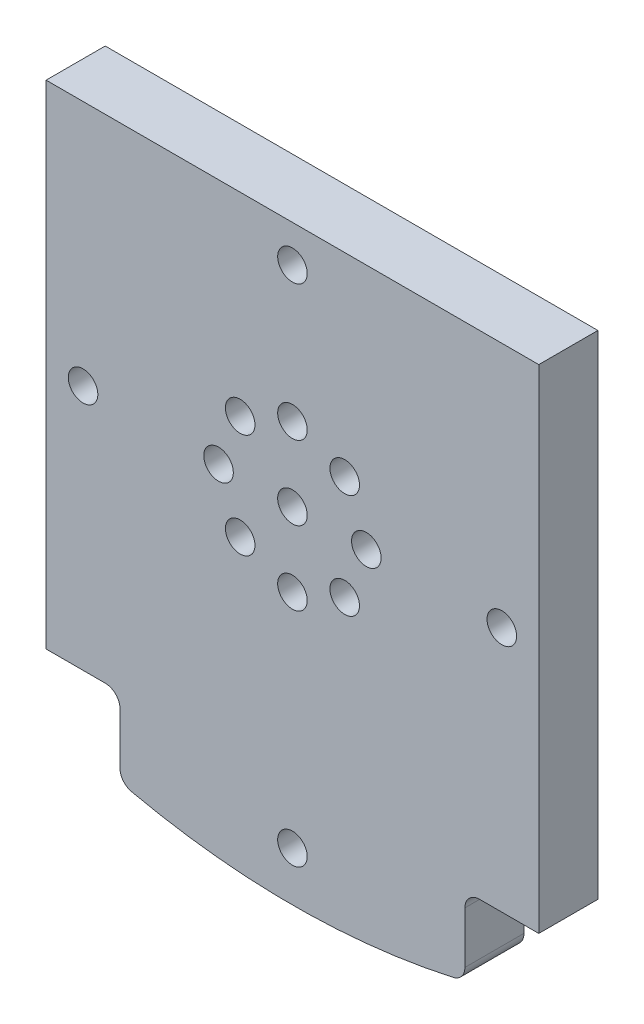
ISO-10303-21;
HEADER;
FILE_DESCRIPTION(('STEP AP214'),'2;1');
FILE_NAME('part.step','',(''),(''),'','','');
FILE_SCHEMA(('AUTOMOTIVE_DESIGN { 1 0 10303 214 1 1 1 1 }'));
ENDSEC;
DATA;
#1=APPLICATION_CONTEXT('core data for automotive mechanical design processes');
#2=APPLICATION_PROTOCOL_DEFINITION('international standard','automotive_design',2000,#1);
#3=PRODUCT_CONTEXT('',#1,'mechanical');
#4=PRODUCT('Part','Part','',(#3));
#5=PRODUCT_RELATED_PRODUCT_CATEGORY('part','',(#4));
#6=PRODUCT_DEFINITION_FORMATION('','',#4);
#7=PRODUCT_DEFINITION_CONTEXT('part definition',#1,'design');
#8=PRODUCT_DEFINITION('design','',#6,#7);
#9=PRODUCT_DEFINITION_SHAPE('','',#8);
#10=(LENGTH_UNIT() NAMED_UNIT(*) SI_UNIT(.MILLI.,.METRE.));
#11=(NAMED_UNIT(*) PLANE_ANGLE_UNIT() SI_UNIT($,.RADIAN.));
#12=(NAMED_UNIT(*) SI_UNIT($,.STERADIAN.) SOLID_ANGLE_UNIT());
#13=UNCERTAINTY_MEASURE_WITH_UNIT(LENGTH_MEASURE(1.E-05),#10,'distance_accuracy_value','');
#14=(GEOMETRIC_REPRESENTATION_CONTEXT(3) GLOBAL_UNCERTAINTY_ASSIGNED_CONTEXT((#13)) GLOBAL_UNIT_ASSIGNED_CONTEXT((#10,
#11,#12)) REPRESENTATION_CONTEXT('',''));
#15=CARTESIAN_POINT('',(0.,0.,0.));
#16=DIRECTION('',(0.,0.,1.));
#17=DIRECTION('',(1.,0.,0.));
#18=AXIS2_PLACEMENT_3D('',#15,#16,#17);
#19=CARTESIAN_POINT('',(0.,-60.,12.));
#20=DIRECTION('',(0.,0.,-1.));
#21=DIRECTION('',(-1.,0.,0.));
#22=AXIS2_PLACEMENT_3D('',#19,#20,#21);
#23=CYLINDRICAL_SURFACE('',#22,3.);
#24=CARTESIAN_POINT('',(0.,-60.,12.));
#25=DIRECTION('',(0.,0.,1.));
#26=DIRECTION('',(1.,0.,0.));
#27=AXIS2_PLACEMENT_3D('',#24,#25,#26);
#28=CIRCLE('',#27,3.);
#29=CARTESIAN_POINT('',(3.,-60.,12.));
#30=VERTEX_POINT('',#29);
#31=EDGE_CURVE('E274',#30,#30,#28,.T.);
#32=ORIENTED_EDGE('',*,*,#31,.T.);
#33=EDGE_LOOP('',(#32));
#34=FACE_BOUND('',#33,.T.);
#35=CARTESIAN_POINT('',(0.,-60.,6.));
#36=DIRECTION('',(0.,0.,-1.));
#37=DIRECTION('',(-1.,0.,0.));
#38=AXIS2_PLACEMENT_3D('',#35,#36,#37);
#39=CIRCLE('',#38,3.);
#40=CARTESIAN_POINT('',(-3.,-60.,6.));
#41=VERTEX_POINT('',#40);
#42=EDGE_CURVE('E37',#41,#41,#39,.T.);
#43=ORIENTED_EDGE('',*,*,#42,.T.);
#44=EDGE_LOOP('',(#43));
#45=FACE_BOUND('',#44,.T.);
#46=ADVANCED_FACE('F33',(#34,#45),#23,.F.);
#47=CARTESIAN_POINT('',(-38.,-53.,12.));
#48=DIRECTION('',(0.,0.,1.));
#49=DIRECTION('',(1.,0.,0.));
#50=AXIS2_PLACEMENT_3D('',#47,#48,#49);
#51=PLANE('',#50);
#52=CARTESIAN_POINT('',(-2.9810173706826E-12,15.,12.));
#53=DIRECTION('',(0.,0.,1.));
#54=DIRECTION('',(1.,0.,0.));
#55=AXIS2_PLACEMENT_3D('',#52,#53,#54);
#56=CIRCLE('',#55,3.);
#57=CARTESIAN_POINT('',(2.99999999999702,15.,12.));
#58=VERTEX_POINT('',#57);
#59=EDGE_CURVE('E313',#58,#58,#56,.T.);
#60=ORIENTED_EDGE('',*,*,#59,.F.);
#61=EDGE_LOOP('',(#60));
#62=FACE_BOUND('',#61,.T.);
#63=CARTESIAN_POINT('',(-15.,-2.1987620058006E-12,12.));
#64=DIRECTION('',(0.,0.,1.));
#65=DIRECTION('',(1.,0.,0.));
#66=AXIS2_PLACEMENT_3D('',#63,#64,#65);
#67=CIRCLE('',#66,3.);
#68=CARTESIAN_POINT('',(-12.,-2.1987620058006E-12,12.));
#69=VERTEX_POINT('',#68);
#70=EDGE_CURVE('E301',#69,#69,#67,.T.);
#71=ORIENTED_EDGE('',*,*,#70,.F.);
#72=EDGE_LOOP('',(#71));
#73=FACE_BOUND('',#72,.T.);
#74=CARTESIAN_POINT('',(6.01949046163952E-13,-15.,12.));
#75=DIRECTION('',(0.,0.,1.));
#76=DIRECTION('',(1.,0.,0.));
#77=AXIS2_PLACEMENT_3D('',#74,#75,#76);
#78=CIRCLE('',#77,3.);
#79=CARTESIAN_POINT('',(3.0000000000006,-15.,12.));
#80=VERTEX_POINT('',#79);
#81=EDGE_CURVE('E289',#80,#80,#78,.T.);
#82=ORIENTED_EDGE('',*,*,#81,.F.);
#83=EDGE_LOOP('',(#82));
#84=FACE_BOUND('',#83,.T.);
#85=CARTESIAN_POINT('',(0.,0.,12.));
#86=DIRECTION('',(0.,0.,1.));
#87=DIRECTION('',(1.,0.,0.));
#88=AXIS2_PLACEMENT_3D('',#85,#86,#87);
#89=CIRCLE('',#88,3.);
#90=CARTESIAN_POINT('',(3.00000000000001,0.,12.));
#91=VERTEX_POINT('',#90);
#92=EDGE_CURVE('E279',#91,#91,#89,.T.);
#93=ORIENTED_EDGE('',*,*,#92,.F.);
#94=EDGE_LOOP('',(#93));
#95=FACE_BOUND('',#94,.T.);
#96=CARTESIAN_POINT('',(42.5,0.,12.));
#97=DIRECTION('',(0.,0.,1.));
#98=DIRECTION('',(1.,0.,0.));
#99=AXIS2_PLACEMENT_3D('',#96,#97,#98);
#100=CIRCLE('',#99,3.);
#101=CARTESIAN_POINT('',(45.5,0.,12.));
#102=VERTEX_POINT('',#101);
#103=EDGE_CURVE('E268',#102,#102,#100,.T.);
#104=ORIENTED_EDGE('',*,*,#103,.F.);
#105=EDGE_LOOP('',(#104));
#106=FACE_BOUND('',#105,.T.);
#107=CARTESIAN_POINT('',(10.6066017177982,-10.6066017177982,12.));
#108=DIRECTION('',(0.,0.,1.));
#109=DIRECTION('',(1.,0.,0.));
#110=AXIS2_PLACEMENT_3D('',#107,#108,#109);
#111=CIRCLE('',#110,3.);
#112=CARTESIAN_POINT('',(13.6066017177982,-10.6066017177982,12.));
#113=VERTEX_POINT('',#112);
#114=EDGE_CURVE('E256',#113,#113,#111,.T.);
#115=ORIENTED_EDGE('',*,*,#114,.F.);
#116=EDGE_LOOP('',(#115));
#117=FACE_BOUND('',#116,.T.);
#118=DIRECTION('',(-1.,0.,0.));
#119=VECTOR('',#118,1.);
#120=CARTESIAN_POINT('',(0.,50.,12.));
#121=LINE('',#120,#119);
#122=CARTESIAN_POINT('',(50.,50.,12.));
#123=VERTEX_POINT('',#122);
#124=CARTESIAN_POINT('',(-50.,50.,12.));
#125=VERTEX_POINT('',#124);
#126=EDGE_CURVE('E51',#123,#125,#121,.T.);
#127=ORIENTED_EDGE('',*,*,#126,.T.);
#128=DIRECTION('',(0.,-1.,0.));
#129=VECTOR('',#128,1.);
#130=CARTESIAN_POINT('',(-50.,-50.,12.));
#131=LINE('',#130,#129);
#132=CARTESIAN_POINT('',(-50.,-50.,12.));
#133=VERTEX_POINT('',#132);
#134=EDGE_CURVE('E107',#125,#133,#131,.T.);
#135=ORIENTED_EDGE('',*,*,#134,.T.);
#136=DIRECTION('',(1.,0.,0.));
#137=VECTOR('',#136,1.);
#138=CARTESIAN_POINT('',(-38.,-50.,12.));
#139=LINE('',#138,#137);
#140=CARTESIAN_POINT('',(-38.,-50.,12.));
#141=VERTEX_POINT('',#140);
#142=EDGE_CURVE('E209',#133,#141,#139,.T.);
#143=ORIENTED_EDGE('',*,*,#142,.T.);
#144=CARTESIAN_POINT('',(-38.,-53.,12.));
#145=DIRECTION('',(0.,0.,-1.));
#146=DIRECTION('',(1.,0.,0.));
#147=AXIS2_PLACEMENT_3D('',#144,#145,#146);
#148=CIRCLE('',#147,3.00000000000001);
#149=CARTESIAN_POINT('',(-35.,-53.,12.));
#150=VERTEX_POINT('',#149);
#151=EDGE_CURVE('E229',#141,#150,#148,.T.);
#152=ORIENTED_EDGE('',*,*,#151,.T.);
#153=DIRECTION('',(0.,-1.,0.));
#154=VECTOR('',#153,1.);
#155=CARTESIAN_POINT('',(-35.,-53.,12.));
#156=LINE('',#155,#154);
#157=CARTESIAN_POINT('',(-35.,-63.4747364521015,12.));
#158=VERTEX_POINT('',#157);
#159=EDGE_CURVE('E226',#150,#158,#156,.T.);
#160=ORIENTED_EDGE('',*,*,#159,.T.);
#161=CARTESIAN_POINT('',(-32.,-63.4747364521015,12.));
#162=DIRECTION('',(0.,0.,1.));
#163=DIRECTION('',(-1.,0.,0.));
#164=AXIS2_PLACEMENT_3D('',#161,#162,#163);
#165=CIRCLE('',#164,3.00000000000002);
#166=CARTESIAN_POINT('',(-32.6530612244898,-66.4027922980628,12.));
#167=VERTEX_POINT('',#166);
#168=EDGE_CURVE('E228',#158,#167,#165,.T.);
#169=ORIENTED_EDGE('',*,*,#168,.T.);
#170=CARTESIAN_POINT('',(0.,80.,12.));
#171=DIRECTION('',(0.,0.,1.));
#172=DIRECTION('',(1.,0.,0.));
#173=AXIS2_PLACEMENT_3D('',#170,#171,#172);
#174=CIRCLE('',#173,150.);
#175=CARTESIAN_POINT('',(32.6530612244897,-66.4027922980628,12.));
#176=VERTEX_POINT('',#175);
#177=EDGE_CURVE('E231',#167,#176,#174,.T.);
#178=ORIENTED_EDGE('',*,*,#177,.T.);
#179=CARTESIAN_POINT('',(32.,-63.4747364521016,12.));
#180=DIRECTION('',(0.,0.,1.));
#181=DIRECTION('',(-1.,0.,0.));
#182=AXIS2_PLACEMENT_3D('',#179,#180,#181);
#183=CIRCLE('',#182,3.00000000000001);
#184=CARTESIAN_POINT('',(35.,-63.4747364521016,12.));
#185=VERTEX_POINT('',#184);
#186=EDGE_CURVE('E237',#176,#185,#183,.T.);
#187=ORIENTED_EDGE('',*,*,#186,.T.);
#188=DIRECTION('',(0.,1.,0.));
#189=VECTOR('',#188,1.);
#190=CARTESIAN_POINT('',(35.,-53.,12.));
#191=LINE('',#190,#189);
#192=CARTESIAN_POINT('',(35.,-53.,12.));
#193=VERTEX_POINT('',#192);
#194=EDGE_CURVE('E140',#185,#193,#191,.T.);
#195=ORIENTED_EDGE('',*,*,#194,.T.);
#196=CARTESIAN_POINT('',(38.,-53.,12.));
#197=DIRECTION('',(0.,0.,-1.));
#198=DIRECTION('',(1.,0.,0.));
#199=AXIS2_PLACEMENT_3D('',#196,#197,#198);
#200=CIRCLE('',#199,3.);
#201=CARTESIAN_POINT('',(38.,-50.,12.));
#202=VERTEX_POINT('',#201);
#203=EDGE_CURVE('E133',#193,#202,#200,.T.);
#204=ORIENTED_EDGE('',*,*,#203,.T.);
#205=DIRECTION('',(1.,0.,0.));
#206=VECTOR('',#205,1.);
#207=CARTESIAN_POINT('',(50.,-50.,12.));
#208=LINE('',#207,#206);
#209=CARTESIAN_POINT('',(50.,-50.,12.));
#210=VERTEX_POINT('',#209);
#211=EDGE_CURVE('E138',#202,#210,#208,.T.);
#212=ORIENTED_EDGE('',*,*,#211,.T.);
#213=DIRECTION('',(0.,1.,0.));
#214=VECTOR('',#213,1.);
#215=CARTESIAN_POINT('',(50.,-50.,12.));
#216=LINE('',#215,#214);
#217=EDGE_CURVE('E154',#210,#123,#216,.T.);
#218=ORIENTED_EDGE('',*,*,#217,.T.);
#219=EDGE_LOOP('',(#127,#135,#143,#152,#160,#169,#178,#187,#195,#204,#212,#218));
#220=FACE_BOUND('',#219,.T.);
#221=CARTESIAN_POINT('',(15.,0.,12.));
#222=DIRECTION('',(0.,0.,1.));
#223=DIRECTION('',(1.,0.,0.));
#224=AXIS2_PLACEMENT_3D('',#221,#222,#223);
#225=CIRCLE('',#224,3.);
#226=CARTESIAN_POINT('',(18.,0.,12.));
#227=VERTEX_POINT('',#226);
#228=EDGE_CURVE('E163',#227,#227,#225,.T.);
#229=ORIENTED_EDGE('',*,*,#228,.F.);
#230=EDGE_LOOP('',(#229));
#231=FACE_BOUND('',#230,.T.);
#232=CARTESIAN_POINT('',(-42.5,0.,12.));
#233=DIRECTION('',(0.,0.,1.));
#234=DIRECTION('',(1.,0.,0.));
#235=AXIS2_PLACEMENT_3D('',#232,#233,#234);
#236=CIRCLE('',#235,3.);
#237=CARTESIAN_POINT('',(-39.5,0.,12.));
#238=VERTEX_POINT('',#237);
#239=EDGE_CURVE('E262',#238,#238,#236,.T.);
#240=ORIENTED_EDGE('',*,*,#239,.F.);
#241=EDGE_LOOP('',(#240));
#242=FACE_BOUND('',#241,.T.);
#243=ORIENTED_EDGE('',*,*,#31,.F.);
#244=EDGE_LOOP('',(#243));
#245=FACE_BOUND('',#244,.T.);
#246=CARTESIAN_POINT('',(0.,42.5,12.));
#247=DIRECTION('',(0.,0.,1.));
#248=DIRECTION('',(1.,0.,0.));
#249=AXIS2_PLACEMENT_3D('',#246,#247,#248);
#250=CIRCLE('',#249,3.);
#251=CARTESIAN_POINT('',(3.00000000000001,42.5,12.));
#252=VERTEX_POINT('',#251);
#253=EDGE_CURVE('E283',#252,#252,#250,.T.);
#254=ORIENTED_EDGE('',*,*,#253,.F.);
#255=EDGE_LOOP('',(#254));
#256=FACE_BOUND('',#255,.T.);
#257=CARTESIAN_POINT('',(-10.6066017177972,-10.6066017177992,12.));
#258=DIRECTION('',(0.,0.,1.));
#259=DIRECTION('',(1.,0.,0.));
#260=AXIS2_PLACEMENT_3D('',#257,#258,#259);
#261=CIRCLE('',#260,3.);
#262=CARTESIAN_POINT('',(-7.60660171779722,-10.6066017177992,12.));
#263=VERTEX_POINT('',#262);
#264=EDGE_CURVE('E295',#263,#263,#261,.T.);
#265=ORIENTED_EDGE('',*,*,#264,.F.);
#266=EDGE_LOOP('',(#265));
#267=FACE_BOUND('',#266,.T.);
#268=CARTESIAN_POINT('',(-10.6066017178002,10.6066017177962,12.));
#269=DIRECTION('',(0.,0.,1.));
#270=DIRECTION('',(1.,0.,0.));
#271=AXIS2_PLACEMENT_3D('',#268,#269,#270);
#272=CIRCLE('',#271,3.);
#273=CARTESIAN_POINT('',(-7.60660171780018,10.6066017177962,12.));
#274=VERTEX_POINT('',#273);
#275=EDGE_CURVE('E307',#274,#274,#272,.T.);
#276=ORIENTED_EDGE('',*,*,#275,.F.);
#277=EDGE_LOOP('',(#276));
#278=FACE_BOUND('',#277,.T.);
#279=CARTESIAN_POINT('',(10.6066017177961,10.6066017178003,12.));
#280=DIRECTION('',(0.,0.,1.));
#281=DIRECTION('',(1.,0.,0.));
#282=AXIS2_PLACEMENT_3D('',#279,#280,#281);
#283=CIRCLE('',#282,3.);
#284=CARTESIAN_POINT('',(13.6066017177961,10.6066017178003,12.));
#285=VERTEX_POINT('',#284);
#286=EDGE_CURVE('E319',#285,#285,#283,.T.);
#287=ORIENTED_EDGE('',*,*,#286,.F.);
#288=EDGE_LOOP('',(#287));
#289=FACE_BOUND('',#288,.T.);
#290=ADVANCED_FACE('F135',(#62,#73,#84,#95,#106,#117,#220,#231,#242,#245,#256,#267,#278,#289),
#51,.T.);
#291=CARTESIAN_POINT('',(-38.,-53.,0.));
#292=DIRECTION('',(0.,0.,1.));
#293=DIRECTION('',(1.,0.,0.));
#294=AXIS2_PLACEMENT_3D('',#291,#292,#293);
#295=PLANE('',#294);
#296=CARTESIAN_POINT('',(0.,-60.,0.));
#297=DIRECTION('',(0.,0.,-1.));
#298=DIRECTION('',(-1.,0.,0.));
#299=AXIS2_PLACEMENT_3D('',#296,#297,#298);
#300=CIRCLE('',#299,5.5);
#301=CARTESIAN_POINT('',(-5.5,-60.,0.));
#302=VERTEX_POINT('',#301);
#303=EDGE_CURVE('E327',#302,#302,#300,.T.);
#304=ORIENTED_EDGE('',*,*,#303,.F.);
#305=EDGE_LOOP('',(#304));
#306=FACE_BOUND('',#305,.T.);
#307=DIRECTION('',(0.,-1.,0.));
#308=VECTOR('',#307,1.);
#309=CARTESIAN_POINT('',(-50.,-50.,0.));
#310=LINE('',#309,#308);
#311=CARTESIAN_POINT('',(-50.,50.,0.));
#312=VERTEX_POINT('',#311);
#313=CARTESIAN_POINT('',(-50.,-50.,0.));
#314=VERTEX_POINT('',#313);
#315=EDGE_CURVE('E160',#312,#314,#310,.T.);
#316=ORIENTED_EDGE('',*,*,#315,.F.);
#317=DIRECTION('',(-1.,0.,0.));
#318=VECTOR('',#317,1.);
#319=CARTESIAN_POINT('',(50.,50.,0.));
#320=LINE('',#319,#318);
#321=CARTESIAN_POINT('',(50.,50.,0.));
#322=VERTEX_POINT('',#321);
#323=EDGE_CURVE('E180',#322,#312,#320,.T.);
#324=ORIENTED_EDGE('',*,*,#323,.F.);
#325=DIRECTION('',(0.,1.,0.));
#326=VECTOR('',#325,1.);
#327=CARTESIAN_POINT('',(50.,-50.,0.));
#328=LINE('',#327,#326);
#329=CARTESIAN_POINT('',(50.,-50.,0.));
#330=VERTEX_POINT('',#329);
#331=EDGE_CURVE('E100',#330,#322,#328,.T.);
#332=ORIENTED_EDGE('',*,*,#331,.F.);
#333=DIRECTION('',(1.,0.,0.));
#334=VECTOR('',#333,1.);
#335=CARTESIAN_POINT('',(50.,-50.,0.));
#336=LINE('',#335,#334);
#337=CARTESIAN_POINT('',(38.,-50.,0.));
#338=VERTEX_POINT('',#337);
#339=EDGE_CURVE('E93',#338,#330,#336,.T.);
#340=ORIENTED_EDGE('',*,*,#339,.F.);
#341=CARTESIAN_POINT('',(38.,-53.,0.));
#342=DIRECTION('',(0.,0.,-1.));
#343=DIRECTION('',(1.,0.,0.));
#344=AXIS2_PLACEMENT_3D('',#341,#342,#343);
#345=CIRCLE('',#344,3.);
#346=CARTESIAN_POINT('',(35.,-53.,0.));
#347=VERTEX_POINT('',#346);
#348=EDGE_CURVE('E148',#347,#338,#345,.T.);
#349=ORIENTED_EDGE('',*,*,#348,.F.);
#350=DIRECTION('',(0.,1.,0.));
#351=VECTOR('',#350,1.);
#352=CARTESIAN_POINT('',(35.,-53.,0.));
#353=LINE('',#352,#351);
#354=CARTESIAN_POINT('',(35.,-63.4747364521016,0.));
#355=VERTEX_POINT('',#354);
#356=EDGE_CURVE('E175',#355,#347,#353,.T.);
#357=ORIENTED_EDGE('',*,*,#356,.F.);
#358=CARTESIAN_POINT('',(32.,-63.4747364521016,0.));
#359=DIRECTION('',(0.,0.,1.));
#360=DIRECTION('',(-1.,0.,0.));
#361=AXIS2_PLACEMENT_3D('',#358,#359,#360);
#362=CIRCLE('',#361,3.00000000000001);
#363=CARTESIAN_POINT('',(32.6530612244897,-66.4027922980628,0.));
#364=VERTEX_POINT('',#363);
#365=EDGE_CURVE('E173',#364,#355,#362,.T.);
#366=ORIENTED_EDGE('',*,*,#365,.F.);
#367=CARTESIAN_POINT('',(0.,80.,0.));
#368=DIRECTION('',(0.,0.,1.));
#369=DIRECTION('',(1.,0.,0.));
#370=AXIS2_PLACEMENT_3D('',#367,#368,#369);
#371=CIRCLE('',#370,150.);
#372=CARTESIAN_POINT('',(-32.6530612244898,-66.4027922980628,0.));
#373=VERTEX_POINT('',#372);
#374=EDGE_CURVE('E171',#373,#364,#371,.T.);
#375=ORIENTED_EDGE('',*,*,#374,.F.);
#376=CARTESIAN_POINT('',(-32.,-63.4747364521015,0.));
#377=DIRECTION('',(0.,0.,1.));
#378=DIRECTION('',(-1.,0.,0.));
#379=AXIS2_PLACEMENT_3D('',#376,#377,#378);
#380=CIRCLE('',#379,3.00000000000002);
#381=CARTESIAN_POINT('',(-35.,-63.4747364521015,0.));
#382=VERTEX_POINT('',#381);
#383=EDGE_CURVE('E169',#382,#373,#380,.T.);
#384=ORIENTED_EDGE('',*,*,#383,.F.);
#385=DIRECTION('',(0.,-1.,0.));
#386=VECTOR('',#385,1.);
#387=CARTESIAN_POINT('',(-35.,-53.,0.));
#388=LINE('',#387,#386);
#389=CARTESIAN_POINT('',(-35.,-53.,0.));
#390=VERTEX_POINT('',#389);
#391=EDGE_CURVE('E167',#390,#382,#388,.T.);
#392=ORIENTED_EDGE('',*,*,#391,.F.);
#393=CARTESIAN_POINT('',(-38.,-53.,0.));
#394=DIRECTION('',(0.,0.,-1.));
#395=DIRECTION('',(1.,0.,0.));
#396=AXIS2_PLACEMENT_3D('',#393,#394,#395);
#397=CIRCLE('',#396,3.00000000000001);
#398=CARTESIAN_POINT('',(-38.,-50.,0.));
#399=VERTEX_POINT('',#398);
#400=EDGE_CURVE('E165',#399,#390,#397,.T.);
#401=ORIENTED_EDGE('',*,*,#400,.F.);
#402=DIRECTION('',(1.,0.,0.));
#403=VECTOR('',#402,1.);
#404=CARTESIAN_POINT('',(-38.,-50.,0.));
#405=LINE('',#404,#403);
#406=EDGE_CURVE('E162',#314,#399,#405,.T.);
#407=ORIENTED_EDGE('',*,*,#406,.F.);
#408=EDGE_LOOP('',(#316,#324,#332,#340,#349,#357,#366,#375,#384,#392,#401,#407));
#409=FACE_BOUND('',#408,.T.);
#410=CARTESIAN_POINT('',(15.,0.,0.));
#411=DIRECTION('',(0.,0.,1.));
#412=DIRECTION('',(1.,0.,0.));
#413=AXIS2_PLACEMENT_3D('',#410,#411,#412);
#414=CIRCLE('',#413,3.);
#415=CARTESIAN_POINT('',(18.,0.,0.));
#416=VERTEX_POINT('',#415);
#417=EDGE_CURVE('E253',#416,#416,#414,.T.);
#418=ORIENTED_EDGE('',*,*,#417,.T.);
#419=EDGE_LOOP('',(#418));
#420=FACE_BOUND('',#419,.T.);
#421=CARTESIAN_POINT('',(10.6066017177982,-10.6066017177982,0.));
#422=DIRECTION('',(0.,0.,1.));
#423=DIRECTION('',(1.,0.,0.));
#424=AXIS2_PLACEMENT_3D('',#421,#422,#423);
#425=CIRCLE('',#424,3.);
#426=CARTESIAN_POINT('',(13.6066017177982,-10.6066017177982,0.));
#427=VERTEX_POINT('',#426);
#428=EDGE_CURVE('E259',#427,#427,#425,.T.);
#429=ORIENTED_EDGE('',*,*,#428,.T.);
#430=EDGE_LOOP('',(#429));
#431=FACE_BOUND('',#430,.T.);
#432=CARTESIAN_POINT('',(-42.5,0.,0.));
#433=DIRECTION('',(0.,0.,1.));
#434=DIRECTION('',(1.,0.,0.));
#435=AXIS2_PLACEMENT_3D('',#432,#433,#434);
#436=CIRCLE('',#435,3.);
#437=CARTESIAN_POINT('',(-39.5,0.,0.));
#438=VERTEX_POINT('',#437);
#439=EDGE_CURVE('E265',#438,#438,#436,.T.);
#440=ORIENTED_EDGE('',*,*,#439,.T.);
#441=EDGE_LOOP('',(#440));
#442=FACE_BOUND('',#441,.T.);
#443=CARTESIAN_POINT('',(42.5,0.,0.));
#444=DIRECTION('',(0.,0.,1.));
#445=DIRECTION('',(1.,0.,0.));
#446=AXIS2_PLACEMENT_3D('',#443,#444,#445);
#447=CIRCLE('',#446,3.);
#448=CARTESIAN_POINT('',(45.5,0.,0.));
#449=VERTEX_POINT('',#448);
#450=EDGE_CURVE('E271',#449,#449,#447,.T.);
#451=ORIENTED_EDGE('',*,*,#450,.T.);
#452=EDGE_LOOP('',(#451));
#453=FACE_BOUND('',#452,.T.);
#454=CARTESIAN_POINT('',(0.,0.,0.));
#455=DIRECTION('',(0.,0.,1.));
#456=DIRECTION('',(1.,0.,0.));
#457=AXIS2_PLACEMENT_3D('',#454,#455,#456);
#458=CIRCLE('',#457,3.);
#459=CARTESIAN_POINT('',(3.00000000000001,0.,0.));
#460=VERTEX_POINT('',#459);
#461=EDGE_CURVE('E280',#460,#460,#458,.T.);
#462=ORIENTED_EDGE('',*,*,#461,.T.);
#463=EDGE_LOOP('',(#462));
#464=FACE_BOUND('',#463,.T.);
#465=CARTESIAN_POINT('',(0.,42.5,0.));
#466=DIRECTION('',(0.,0.,1.));
#467=DIRECTION('',(1.,0.,0.));
#468=AXIS2_PLACEMENT_3D('',#465,#466,#467);
#469=CIRCLE('',#468,3.);
#470=CARTESIAN_POINT('',(3.00000000000001,42.5,0.));
#471=VERTEX_POINT('',#470);
#472=EDGE_CURVE('E286',#471,#471,#469,.T.);
#473=ORIENTED_EDGE('',*,*,#472,.T.);
#474=EDGE_LOOP('',(#473));
#475=FACE_BOUND('',#474,.T.);
#476=CARTESIAN_POINT('',(6.01949046163952E-13,-15.,0.));
#477=DIRECTION('',(0.,0.,1.));
#478=DIRECTION('',(1.,0.,0.));
#479=AXIS2_PLACEMENT_3D('',#476,#477,#478);
#480=CIRCLE('',#479,3.);
#481=CARTESIAN_POINT('',(3.0000000000006,-15.,0.));
#482=VERTEX_POINT('',#481);
#483=EDGE_CURVE('E292',#482,#482,#480,.T.);
#484=ORIENTED_EDGE('',*,*,#483,.T.);
#485=EDGE_LOOP('',(#484));
#486=FACE_BOUND('',#485,.T.);
#487=CARTESIAN_POINT('',(-10.6066017177972,-10.6066017177992,0.));
#488=DIRECTION('',(0.,0.,1.));
#489=DIRECTION('',(1.,0.,0.));
#490=AXIS2_PLACEMENT_3D('',#487,#488,#489);
#491=CIRCLE('',#490,3.);
#492=CARTESIAN_POINT('',(-7.60660171779722,-10.6066017177992,0.));
#493=VERTEX_POINT('',#492);
#494=EDGE_CURVE('E298',#493,#493,#491,.T.);
#495=ORIENTED_EDGE('',*,*,#494,.T.);
#496=EDGE_LOOP('',(#495));
#497=FACE_BOUND('',#496,.T.);
#498=CARTESIAN_POINT('',(-15.,-2.1987620058006E-12,0.));
#499=DIRECTION('',(0.,0.,1.));
#500=DIRECTION('',(1.,0.,0.));
#501=AXIS2_PLACEMENT_3D('',#498,#499,#500);
#502=CIRCLE('',#501,3.);
#503=CARTESIAN_POINT('',(-12.,-2.1987620058006E-12,0.));
#504=VERTEX_POINT('',#503);
#505=EDGE_CURVE('E304',#504,#504,#502,.T.);
#506=ORIENTED_EDGE('',*,*,#505,.T.);
#507=EDGE_LOOP('',(#506));
#508=FACE_BOUND('',#507,.T.);
#509=CARTESIAN_POINT('',(-10.6066017178002,10.6066017177962,0.));
#510=DIRECTION('',(0.,0.,1.));
#511=DIRECTION('',(1.,0.,0.));
#512=AXIS2_PLACEMENT_3D('',#509,#510,#511);
#513=CIRCLE('',#512,3.);
#514=CARTESIAN_POINT('',(-7.60660171780018,10.6066017177962,0.));
#515=VERTEX_POINT('',#514);
#516=EDGE_CURVE('E310',#515,#515,#513,.T.);
#517=ORIENTED_EDGE('',*,*,#516,.T.);
#518=EDGE_LOOP('',(#517));
#519=FACE_BOUND('',#518,.T.);
#520=CARTESIAN_POINT('',(-2.9810173706826E-12,15.,0.));
#521=DIRECTION('',(0.,0.,1.));
#522=DIRECTION('',(1.,0.,0.));
#523=AXIS2_PLACEMENT_3D('',#520,#521,#522);
#524=CIRCLE('',#523,3.);
#525=CARTESIAN_POINT('',(2.99999999999702,15.,0.));
#526=VERTEX_POINT('',#525);
#527=EDGE_CURVE('E316',#526,#526,#524,.T.);
#528=ORIENTED_EDGE('',*,*,#527,.T.);
#529=EDGE_LOOP('',(#528));
#530=FACE_BOUND('',#529,.T.);
#531=CARTESIAN_POINT('',(10.6066017177961,10.6066017178003,0.));
#532=DIRECTION('',(0.,0.,1.));
#533=DIRECTION('',(1.,0.,0.));
#534=AXIS2_PLACEMENT_3D('',#531,#532,#533);
#535=CIRCLE('',#534,3.);
#536=CARTESIAN_POINT('',(13.6066017177961,10.6066017178003,0.));
#537=VERTEX_POINT('',#536);
#538=EDGE_CURVE('E322',#537,#537,#535,.T.);
#539=ORIENTED_EDGE('',*,*,#538,.T.);
#540=EDGE_LOOP('',(#539));
#541=FACE_BOUND('',#540,.T.);
#542=ADVANCED_FACE('F213',(#306,#409,#420,#431,#442,#453,#464,#475,#486,#497,#508,#519,#530,
#541),#295,.F.);
#543=CARTESIAN_POINT('',(-50.,-50.,12.));
#544=DIRECTION('',(1.,0.,0.));
#545=DIRECTION('',(0.,0.,-1.));
#546=AXIS2_PLACEMENT_3D('',#543,#544,#545);
#547=PLANE('',#546);
#548=ORIENTED_EDGE('',*,*,#315,.T.);
#549=DIRECTION('',(0.,0.,-1.));
#550=VECTOR('',#549,1.);
#551=CARTESIAN_POINT('',(-50.,-50.,12.));
#552=LINE('',#551,#550);
#553=EDGE_CURVE('E43',#133,#314,#552,.T.);
#554=ORIENTED_EDGE('',*,*,#553,.F.);
#555=ORIENTED_EDGE('',*,*,#134,.F.);
#556=DIRECTION('',(0.,0.,-1.));
#557=VECTOR('',#556,1.);
#558=CARTESIAN_POINT('',(-50.,50.,12.));
#559=LINE('',#558,#557);
#560=EDGE_CURVE('E11',#125,#312,#559,.T.);
#561=ORIENTED_EDGE('',*,*,#560,.T.);
#562=EDGE_LOOP('',(#548,#554,#555,#561));
#563=FACE_BOUND('',#562,.T.);
#564=ADVANCED_FACE('F35',(#563),#547,.F.);
#565=CARTESIAN_POINT('',(-38.,-50.,12.));
#566=DIRECTION('',(0.,1.,0.));
#567=DIRECTION('',(-1.,0.,0.));
#568=AXIS2_PLACEMENT_3D('',#565,#566,#567);
#569=PLANE('',#568);
#570=ORIENTED_EDGE('',*,*,#406,.T.);
#571=DIRECTION('',(0.,0.,-1.));
#572=VECTOR('',#571,1.);
#573=CARTESIAN_POINT('',(-38.,-50.,12.));
#574=LINE('',#573,#572);
#575=EDGE_CURVE('E200',#141,#399,#574,.T.);
#576=ORIENTED_EDGE('',*,*,#575,.F.);
#577=ORIENTED_EDGE('',*,*,#142,.F.);
#578=ORIENTED_EDGE('',*,*,#553,.T.);
#579=EDGE_LOOP('',(#570,#576,#577,#578));
#580=FACE_BOUND('',#579,.T.);
#581=ADVANCED_FACE('F207',(#580),#569,.F.);
#582=CARTESIAN_POINT('',(-38.,-53.,12.));
#583=DIRECTION('',(0.,0.,-1.));
#584=DIRECTION('',(-1.,0.,0.));
#585=AXIS2_PLACEMENT_3D('',#582,#583,#584);
#586=CYLINDRICAL_SURFACE('',#585,3.00000000000001);
#587=ORIENTED_EDGE('',*,*,#400,.T.);
#588=DIRECTION('',(0.,0.,-1.));
#589=VECTOR('',#588,1.);
#590=CARTESIAN_POINT('',(-35.,-53.,12.));
#591=LINE('',#590,#589);
#592=EDGE_CURVE('E197',#150,#390,#591,.T.);
#593=ORIENTED_EDGE('',*,*,#592,.F.);
#594=ORIENTED_EDGE('',*,*,#151,.F.);
#595=ORIENTED_EDGE('',*,*,#575,.T.);
#596=EDGE_LOOP('',(#587,#593,#594,#595));
#597=FACE_BOUND('',#596,.T.);
#598=ADVANCED_FACE('F220',(#597),#586,.F.);
#599=CARTESIAN_POINT('',(-35.,-53.,12.));
#600=DIRECTION('',(1.,0.,0.));
#601=DIRECTION('',(0.,0.,-1.));
#602=AXIS2_PLACEMENT_3D('',#599,#600,#601);
#603=PLANE('',#602);
#604=ORIENTED_EDGE('',*,*,#391,.T.);
#605=DIRECTION('',(0.,0.,-1.));
#606=VECTOR('',#605,1.);
#607=CARTESIAN_POINT('',(-35.,-63.4747364521015,12.));
#608=LINE('',#607,#606);
#609=EDGE_CURVE('E194',#158,#382,#608,.T.);
#610=ORIENTED_EDGE('',*,*,#609,.F.);
#611=ORIENTED_EDGE('',*,*,#159,.F.);
#612=ORIENTED_EDGE('',*,*,#592,.T.);
#613=EDGE_LOOP('',(#604,#610,#611,#612));
#614=FACE_BOUND('',#613,.T.);
#615=ADVANCED_FACE('F224',(#614),#603,.F.);
#616=CARTESIAN_POINT('',(-32.,-63.4747364521015,12.));
#617=DIRECTION('',(0.,0.,-1.));
#618=DIRECTION('',(-1.,0.,0.));
#619=AXIS2_PLACEMENT_3D('',#616,#617,#618);
#620=CYLINDRICAL_SURFACE('',#619,3.00000000000002);
#621=ORIENTED_EDGE('',*,*,#383,.T.);
#622=DIRECTION('',(0.,0.,-1.));
#623=VECTOR('',#622,1.);
#624=CARTESIAN_POINT('',(-32.6530612244898,-66.4027922980628,12.));
#625=LINE('',#624,#623);
#626=EDGE_CURVE('E191',#167,#373,#625,.T.);
#627=ORIENTED_EDGE('',*,*,#626,.F.);
#628=ORIENTED_EDGE('',*,*,#168,.F.);
#629=ORIENTED_EDGE('',*,*,#609,.T.);
#630=EDGE_LOOP('',(#621,#627,#628,#629));
#631=FACE_BOUND('',#630,.T.);
#632=ADVANCED_FACE('F394',(#631),#620,.T.);
#633=CARTESIAN_POINT('',(0.,80.,12.));
#634=DIRECTION('',(0.,0.,-1.));
#635=DIRECTION('',(-1.,0.,0.));
#636=AXIS2_PLACEMENT_3D('',#633,#634,#635);
#637=CYLINDRICAL_SURFACE('',#636,150.);
#638=ORIENTED_EDGE('',*,*,#374,.T.);
#639=DIRECTION('',(0.,0.,-1.));
#640=VECTOR('',#639,1.);
#641=CARTESIAN_POINT('',(32.6530612244897,-66.4027922980628,12.));
#642=LINE('',#641,#640);
#643=EDGE_CURVE('E188',#176,#364,#642,.T.);
#644=ORIENTED_EDGE('',*,*,#643,.F.);
#645=ORIENTED_EDGE('',*,*,#177,.F.);
#646=ORIENTED_EDGE('',*,*,#626,.T.);
#647=EDGE_LOOP('',(#638,#644,#645,#646));
#648=FACE_BOUND('',#647,.T.);
#649=ADVANCED_FACE('F391',(#648),#637,.T.);
#650=CARTESIAN_POINT('',(32.,-63.4747364521016,12.));
#651=DIRECTION('',(0.,0.,-1.));
#652=DIRECTION('',(-1.,0.,0.));
#653=AXIS2_PLACEMENT_3D('',#650,#651,#652);
#654=CYLINDRICAL_SURFACE('',#653,3.00000000000001);
#655=ORIENTED_EDGE('',*,*,#365,.T.);
#656=DIRECTION('',(0.,0.,-1.));
#657=VECTOR('',#656,1.);
#658=CARTESIAN_POINT('',(35.,-63.4747364521016,12.));
#659=LINE('',#658,#657);
#660=EDGE_CURVE('E185',#185,#355,#659,.T.);
#661=ORIENTED_EDGE('',*,*,#660,.F.);
#662=ORIENTED_EDGE('',*,*,#186,.F.);
#663=ORIENTED_EDGE('',*,*,#643,.T.);
#664=EDGE_LOOP('',(#655,#661,#662,#663));
#665=FACE_BOUND('',#664,.T.);
#666=ADVANCED_FACE('F243',(#665),#654,.T.);
#667=CARTESIAN_POINT('',(35.,-53.,12.));
#668=DIRECTION('',(-1.,0.,0.));
#669=DIRECTION('',(0.,-1.,0.));
#670=AXIS2_PLACEMENT_3D('',#667,#668,#669);
#671=PLANE('',#670);
#672=ORIENTED_EDGE('',*,*,#356,.T.);
#673=DIRECTION('',(0.,0.,-1.));
#674=VECTOR('',#673,1.);
#675=CARTESIAN_POINT('',(35.,-53.,12.));
#676=LINE('',#675,#674);
#677=EDGE_CURVE('E149',#193,#347,#676,.T.);
#678=ORIENTED_EDGE('',*,*,#677,.F.);
#679=ORIENTED_EDGE('',*,*,#194,.F.);
#680=ORIENTED_EDGE('',*,*,#660,.T.);
#681=EDGE_LOOP('',(#672,#678,#679,#680));
#682=FACE_BOUND('',#681,.T.);
#683=ADVANCED_FACE('F247',(#682),#671,.F.);
#684=CARTESIAN_POINT('',(38.,-53.,12.));
#685=DIRECTION('',(0.,0.,-1.));
#686=DIRECTION('',(-1.,0.,0.));
#687=AXIS2_PLACEMENT_3D('',#684,#685,#686);
#688=CYLINDRICAL_SURFACE('',#687,3.);
#689=ORIENTED_EDGE('',*,*,#348,.T.);
#690=DIRECTION('',(0.,0.,-1.));
#691=VECTOR('',#690,1.);
#692=CARTESIAN_POINT('',(38.,-50.,12.));
#693=LINE('',#692,#691);
#694=EDGE_CURVE('E145',#202,#338,#693,.T.);
#695=ORIENTED_EDGE('',*,*,#694,.F.);
#696=ORIENTED_EDGE('',*,*,#203,.F.);
#697=ORIENTED_EDGE('',*,*,#677,.T.);
#698=EDGE_LOOP('',(#689,#695,#696,#697));
#699=FACE_BOUND('',#698,.T.);
#700=ADVANCED_FACE('F146',(#699),#688,.F.);
#701=CARTESIAN_POINT('',(50.,-50.,12.));
#702=DIRECTION('',(0.,1.,0.));
#703=DIRECTION('',(-1.,0.,0.));
#704=AXIS2_PLACEMENT_3D('',#701,#702,#703);
#705=PLANE('',#704);
#706=ORIENTED_EDGE('',*,*,#339,.T.);
#707=DIRECTION('',(0.,0.,-1.));
#708=VECTOR('',#707,1.);
#709=CARTESIAN_POINT('',(50.,-50.,12.));
#710=LINE('',#709,#708);
#711=EDGE_CURVE('E150',#210,#330,#710,.T.);
#712=ORIENTED_EDGE('',*,*,#711,.F.);
#713=ORIENTED_EDGE('',*,*,#211,.F.);
#714=ORIENTED_EDGE('',*,*,#694,.T.);
#715=EDGE_LOOP('',(#706,#712,#713,#714));
#716=FACE_BOUND('',#715,.T.);
#717=ADVANCED_FACE('F152',(#716),#705,.F.);
#718=CARTESIAN_POINT('',(50.,-50.,12.));
#719=DIRECTION('',(-1.,0.,0.));
#720=DIRECTION('',(0.,0.,1.));
#721=AXIS2_PLACEMENT_3D('',#718,#719,#720);
#722=PLANE('',#721);
#723=ORIENTED_EDGE('',*,*,#331,.T.);
#724=DIRECTION('',(0.,0.,-1.));
#725=VECTOR('',#724,1.);
#726=CARTESIAN_POINT('',(50.,50.,12.));
#727=LINE('',#726,#725);
#728=EDGE_CURVE('E156',#123,#322,#727,.T.);
#729=ORIENTED_EDGE('',*,*,#728,.F.);
#730=ORIENTED_EDGE('',*,*,#217,.F.);
#731=ORIENTED_EDGE('',*,*,#711,.T.);
#732=EDGE_LOOP('',(#723,#729,#730,#731));
#733=FACE_BOUND('',#732,.T.);
#734=ADVANCED_FACE('F249',(#733),#722,.F.);
#735=CARTESIAN_POINT('',(50.,50.,12.));
#736=DIRECTION('',(0.,-1.,0.));
#737=DIRECTION('',(1.,0.,0.));
#738=AXIS2_PLACEMENT_3D('',#735,#736,#737);
#739=PLANE('',#738);
#740=ORIENTED_EDGE('',*,*,#323,.T.);
#741=ORIENTED_EDGE('',*,*,#560,.F.);
#742=ORIENTED_EDGE('',*,*,#126,.F.);
#743=ORIENTED_EDGE('',*,*,#728,.T.);
#744=EDGE_LOOP('',(#740,#741,#742,#743));
#745=FACE_BOUND('',#744,.T.);
#746=ADVANCED_FACE('F248',(#745),#739,.F.);
#747=CARTESIAN_POINT('',(15.,0.,12.));
#748=DIRECTION('',(0.,0.,-1.));
#749=DIRECTION('',(-1.,0.,0.));
#750=AXIS2_PLACEMENT_3D('',#747,#748,#749);
#751=CYLINDRICAL_SURFACE('',#750,3.);
#752=ORIENTED_EDGE('',*,*,#228,.T.);
#753=EDGE_LOOP('',(#752));
#754=FACE_BOUND('',#753,.T.);
#755=ORIENTED_EDGE('',*,*,#417,.F.);
#756=EDGE_LOOP('',(#755));
#757=FACE_BOUND('',#756,.T.);
#758=ADVANCED_FACE('F371',(#754,#757),#751,.F.);
#759=CARTESIAN_POINT('',(10.6066017177982,-10.6066017177982,12.));
#760=DIRECTION('',(0.,0.,-1.));
#761=DIRECTION('',(-1.,0.,0.));
#762=AXIS2_PLACEMENT_3D('',#759,#760,#761);
#763=CYLINDRICAL_SURFACE('',#762,3.);
#764=ORIENTED_EDGE('',*,*,#114,.T.);
#765=EDGE_LOOP('',(#764));
#766=FACE_BOUND('',#765,.T.);
#767=ORIENTED_EDGE('',*,*,#428,.F.);
#768=EDGE_LOOP('',(#767));
#769=FACE_BOUND('',#768,.T.);
#770=ADVANCED_FACE('F367',(#766,#769),#763,.F.);
#771=CARTESIAN_POINT('',(-42.5,0.,12.));
#772=DIRECTION('',(0.,0.,-1.));
#773=DIRECTION('',(-1.,0.,0.));
#774=AXIS2_PLACEMENT_3D('',#771,#772,#773);
#775=CYLINDRICAL_SURFACE('',#774,3.);
#776=ORIENTED_EDGE('',*,*,#239,.T.);
#777=EDGE_LOOP('',(#776));
#778=FACE_BOUND('',#777,.T.);
#779=ORIENTED_EDGE('',*,*,#439,.F.);
#780=EDGE_LOOP('',(#779));
#781=FACE_BOUND('',#780,.T.);
#782=ADVANCED_FACE('F363',(#778,#781),#775,.F.);
#783=CARTESIAN_POINT('',(42.5,0.,12.));
#784=DIRECTION('',(0.,0.,-1.));
#785=DIRECTION('',(-1.,0.,0.));
#786=AXIS2_PLACEMENT_3D('',#783,#784,#785);
#787=CYLINDRICAL_SURFACE('',#786,3.);
#788=ORIENTED_EDGE('',*,*,#103,.T.);
#789=EDGE_LOOP('',(#788));
#790=FACE_BOUND('',#789,.T.);
#791=ORIENTED_EDGE('',*,*,#450,.F.);
#792=EDGE_LOOP('',(#791));
#793=FACE_BOUND('',#792,.T.);
#794=ADVANCED_FACE('F360',(#790,#793),#787,.F.);
#795=CARTESIAN_POINT('',(0.,0.,12.));
#796=DIRECTION('',(0.,0.,-1.));
#797=DIRECTION('',(-1.,0.,0.));
#798=AXIS2_PLACEMENT_3D('',#795,#796,#797);
#799=CYLINDRICAL_SURFACE('',#798,3.);
#800=ORIENTED_EDGE('',*,*,#92,.T.);
#801=EDGE_LOOP('',(#800));
#802=FACE_BOUND('',#801,.T.);
#803=ORIENTED_EDGE('',*,*,#461,.F.);
#804=EDGE_LOOP('',(#803));
#805=FACE_BOUND('',#804,.T.);
#806=ADVANCED_FACE('F358',(#802,#805),#799,.F.);
#807=CARTESIAN_POINT('',(0.,42.5,12.));
#808=DIRECTION('',(0.,0.,-1.));
#809=DIRECTION('',(-1.,0.,0.));
#810=AXIS2_PLACEMENT_3D('',#807,#808,#809);
#811=CYLINDRICAL_SURFACE('',#810,3.);
#812=ORIENTED_EDGE('',*,*,#253,.T.);
#813=EDGE_LOOP('',(#812));
#814=FACE_BOUND('',#813,.T.);
#815=ORIENTED_EDGE('',*,*,#472,.F.);
#816=EDGE_LOOP('',(#815));
#817=FACE_BOUND('',#816,.T.);
#818=ADVANCED_FACE('F508',(#814,#817),#811,.F.);
#819=CARTESIAN_POINT('',(6.01949046163952E-13,-15.,12.));
#820=DIRECTION('',(0.,0.,-1.));
#821=DIRECTION('',(-1.,0.,0.));
#822=AXIS2_PLACEMENT_3D('',#819,#820,#821);
#823=CYLINDRICAL_SURFACE('',#822,3.);
#824=ORIENTED_EDGE('',*,*,#81,.T.);
#825=EDGE_LOOP('',(#824));
#826=FACE_BOUND('',#825,.T.);
#827=ORIENTED_EDGE('',*,*,#483,.F.);
#828=EDGE_LOOP('',(#827));
#829=FACE_BOUND('',#828,.T.);
#830=ADVANCED_FACE('F516',(#826,#829),#823,.F.);
#831=CARTESIAN_POINT('',(-10.6066017177972,-10.6066017177992,12.));
#832=DIRECTION('',(0.,0.,-1.));
#833=DIRECTION('',(-1.,0.,0.));
#834=AXIS2_PLACEMENT_3D('',#831,#832,#833);
#835=CYLINDRICAL_SURFACE('',#834,3.);
#836=ORIENTED_EDGE('',*,*,#264,.T.);
#837=EDGE_LOOP('',(#836));
#838=FACE_BOUND('',#837,.T.);
#839=ORIENTED_EDGE('',*,*,#494,.F.);
#840=EDGE_LOOP('',(#839));
#841=FACE_BOUND('',#840,.T.);
#842=ADVANCED_FACE('F524',(#838,#841),#835,.F.);
#843=CARTESIAN_POINT('',(-15.,-2.1987620058006E-12,12.));
#844=DIRECTION('',(0.,0.,-1.));
#845=DIRECTION('',(-1.,0.,0.));
#846=AXIS2_PLACEMENT_3D('',#843,#844,#845);
#847=CYLINDRICAL_SURFACE('',#846,3.);
#848=ORIENTED_EDGE('',*,*,#70,.T.);
#849=EDGE_LOOP('',(#848));
#850=FACE_BOUND('',#849,.T.);
#851=ORIENTED_EDGE('',*,*,#505,.F.);
#852=EDGE_LOOP('',(#851));
#853=FACE_BOUND('',#852,.T.);
#854=ADVANCED_FACE('F533',(#850,#853),#847,.F.);
#855=CARTESIAN_POINT('',(-10.6066017178002,10.6066017177962,12.));
#856=DIRECTION('',(0.,0.,-1.));
#857=DIRECTION('',(-1.,0.,0.));
#858=AXIS2_PLACEMENT_3D('',#855,#856,#857);
#859=CYLINDRICAL_SURFACE('',#858,3.);
#860=ORIENTED_EDGE('',*,*,#275,.T.);
#861=EDGE_LOOP('',(#860));
#862=FACE_BOUND('',#861,.T.);
#863=ORIENTED_EDGE('',*,*,#516,.F.);
#864=EDGE_LOOP('',(#863));
#865=FACE_BOUND('',#864,.T.);
#866=ADVANCED_FACE('F542',(#862,#865),#859,.F.);
#867=CARTESIAN_POINT('',(-2.9810173706826E-12,15.,12.));
#868=DIRECTION('',(0.,0.,-1.));
#869=DIRECTION('',(-1.,0.,0.));
#870=AXIS2_PLACEMENT_3D('',#867,#868,#869);
#871=CYLINDRICAL_SURFACE('',#870,3.);
#872=ORIENTED_EDGE('',*,*,#59,.T.);
#873=EDGE_LOOP('',(#872));
#874=FACE_BOUND('',#873,.T.);
#875=ORIENTED_EDGE('',*,*,#527,.F.);
#876=EDGE_LOOP('',(#875));
#877=FACE_BOUND('',#876,.T.);
#878=ADVANCED_FACE('F551',(#874,#877),#871,.F.);
#879=CARTESIAN_POINT('',(10.6066017177961,10.6066017178003,12.));
#880=DIRECTION('',(0.,0.,-1.));
#881=DIRECTION('',(-1.,0.,0.));
#882=AXIS2_PLACEMENT_3D('',#879,#880,#881);
#883=CYLINDRICAL_SURFACE('',#882,3.);
#884=ORIENTED_EDGE('',*,*,#286,.T.);
#885=EDGE_LOOP('',(#884));
#886=FACE_BOUND('',#885,.T.);
#887=ORIENTED_EDGE('',*,*,#538,.F.);
#888=EDGE_LOOP('',(#887));
#889=FACE_BOUND('',#888,.T.);
#890=ADVANCED_FACE('F345',(#886,#889),#883,.F.);
#891=CARTESIAN_POINT('',(0.,-60.,6.));
#892=DIRECTION('',(0.,0.,-1.));
#893=DIRECTION('',(-1.,0.,0.));
#894=AXIS2_PLACEMENT_3D('',#891,#892,#893);
#895=CYLINDRICAL_SURFACE('',#894,5.5);
#896=CARTESIAN_POINT('',(0.,-60.,6.));
#897=DIRECTION('',(0.,0.,-1.));
#898=DIRECTION('',(-1.,0.,0.));
#899=AXIS2_PLACEMENT_3D('',#896,#897,#898);
#900=CIRCLE('',#899,5.5);
#901=CARTESIAN_POINT('',(-5.5,-60.,6.));
#902=VERTEX_POINT('',#901);
#903=EDGE_CURVE('E330',#902,#902,#900,.T.);
#904=ORIENTED_EDGE('',*,*,#903,.F.);
#905=EDGE_LOOP('',(#904));
#906=FACE_BOUND('',#905,.T.);
#907=ORIENTED_EDGE('',*,*,#303,.T.);
#908=EDGE_LOOP('',(#907));
#909=FACE_BOUND('',#908,.T.);
#910=ADVANCED_FACE('F340',(#906,#909),#895,.F.);
#911=CARTESIAN_POINT('',(0.,-60.,6.));
#912=DIRECTION('',(0.,0.,-1.));
#913=DIRECTION('',(-1.,0.,0.));
#914=AXIS2_PLACEMENT_3D('',#911,#912,#913);
#915=PLANE('',#914);
#916=ORIENTED_EDGE('',*,*,#42,.F.);
#917=EDGE_LOOP('',(#916));
#918=FACE_BOUND('',#917,.T.);
#919=ORIENTED_EDGE('',*,*,#903,.T.);
#920=EDGE_LOOP('',(#919));
#921=FACE_BOUND('',#920,.T.);
#922=ADVANCED_FACE('F338',(#918,#921),#915,.T.);
#923=CLOSED_SHELL('',(#46,#290,#542,#564,#581,#598,#615,#632,#649,#666,#683,#700,#717,#734,#746,
#758,#770,#782,#794,#806,#818,#830,#842,#854,#866,#878,#890,#910,#922));
#924=MANIFOLD_SOLID_BREP('B2',#923);
#925=ADVANCED_BREP_SHAPE_REPRESENTATION('',(#18,#924),#14);
#926=SHAPE_DEFINITION_REPRESENTATION(#9,#925);
ENDSEC;
END-ISO-10303-21;
